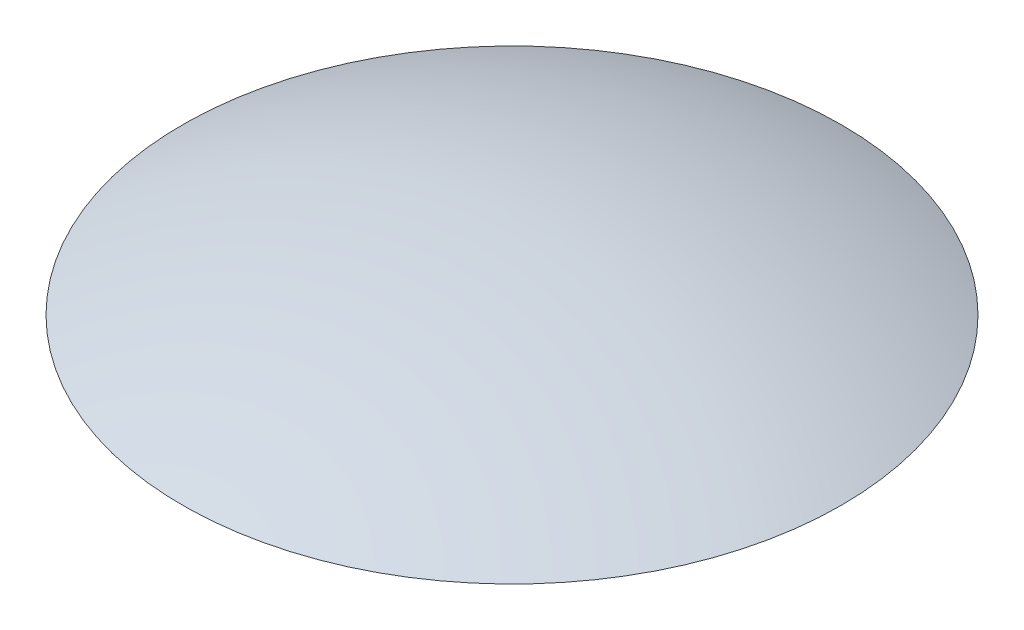
ISO-10303-21;
HEADER;
FILE_DESCRIPTION(('STEP AP214'),'2;1');
FILE_NAME('part.step','',(''),(''),'','','');
FILE_SCHEMA(('AUTOMOTIVE_DESIGN { 1 0 10303 214 1 1 1 1 }'));
ENDSEC;
DATA;
#1=APPLICATION_CONTEXT('core data for automotive mechanical design processes');
#2=APPLICATION_PROTOCOL_DEFINITION('international standard','automotive_design',2000,#1);
#3=PRODUCT_CONTEXT('',#1,'mechanical');
#4=PRODUCT('Part','Part','',(#3));
#5=PRODUCT_RELATED_PRODUCT_CATEGORY('part','',(#4));
#6=PRODUCT_DEFINITION_FORMATION('','',#4);
#7=PRODUCT_DEFINITION_CONTEXT('part definition',#1,'design');
#8=PRODUCT_DEFINITION('design','',#6,#7);
#9=PRODUCT_DEFINITION_SHAPE('','',#8);
#10=(LENGTH_UNIT() NAMED_UNIT(*) SI_UNIT(.MILLI.,.METRE.));
#11=(NAMED_UNIT(*) PLANE_ANGLE_UNIT() SI_UNIT($,.RADIAN.));
#12=(NAMED_UNIT(*) SI_UNIT($,.STERADIAN.) SOLID_ANGLE_UNIT());
#13=UNCERTAINTY_MEASURE_WITH_UNIT(LENGTH_MEASURE(1.E-05),#10,'distance_accuracy_value','');
#14=(GEOMETRIC_REPRESENTATION_CONTEXT(3) GLOBAL_UNCERTAINTY_ASSIGNED_CONTEXT((#13)) GLOBAL_UNIT_ASSIGNED_CONTEXT((#10,
#11,#12)) REPRESENTATION_CONTEXT('',''));
#15=CARTESIAN_POINT('',(0.,0.,0.));
#16=DIRECTION('',(0.,0.,1.));
#17=DIRECTION('',(1.,0.,0.));
#18=AXIS2_PLACEMENT_3D('',#15,#16,#17);
#19=CARTESIAN_POINT('',(0.,0.,0.));
#20=DIRECTION('',(0.,-1.,0.));
#21=DIRECTION('',(1.,0.,0.));
#22=AXIS2_PLACEMENT_3D('',#19,#20,#21);
#23=SPHERICAL_SURFACE('',#22,16.8);
#24=CARTESIAN_POINT('',(0.,15.27219696049,0.));
#25=DIRECTION('',(0.,-1.,0.));
#26=DIRECTION('',(0.,0.,-1.));
#27=AXIS2_PLACEMENT_3D('',#24,#25,#26);
#28=CIRCLE('',#27,7.);
#29=CARTESIAN_POINT('',(0.,15.27219696049,-7.));
#30=VERTEX_POINT('',#29);
#31=EDGE_CURVE('E40',#30,#30,#28,.T.);
#32=ORIENTED_EDGE('',*,*,#31,.F.);
#33=EDGE_LOOP('',(#32));
#34=FACE_BOUND('',#33,.T.);
#35=ADVANCED_FACE('F34',(#34),#23,.T.);
#36=CARTESIAN_POINT('',(0.,0.,0.));
#37=DIRECTION('',(0.,-1.,0.));
#38=DIRECTION('',(1.,0.,0.));
#39=AXIS2_PLACEMENT_3D('',#36,#37,#38);
#40=SPHERICAL_SURFACE('',#39,15.8);
#41=CARTESIAN_POINT('',(0.,15.27219696049,0.));
#42=DIRECTION('',(0.,-1.,0.));
#43=DIRECTION('',(0.,0.,-1.));
#44=AXIS2_PLACEMENT_3D('',#41,#42,#43);
#45=CIRCLE('',#44,4.04969134626331);
#46=CARTESIAN_POINT('',(0.,15.27219696049,-4.04969134626331));
#47=VERTEX_POINT('',#46);
#48=EDGE_CURVE('E10',#47,#47,#45,.T.);
#49=ORIENTED_EDGE('',*,*,#48,.T.);
#50=EDGE_LOOP('',(#49));
#51=FACE_BOUND('',#50,.T.);
#52=ADVANCED_FACE('F50',(#51),#40,.F.);
#53=CARTESIAN_POINT('',(4.04969134626331,15.27219696049,0.));
#54=DIRECTION('',(0.,-1.,0.));
#55=DIRECTION('',(0.,0.,-1.));
#56=AXIS2_PLACEMENT_3D('',#53,#54,#55);
#57=PLANE('',#56);
#58=ORIENTED_EDGE('',*,*,#31,.T.);
#59=EDGE_LOOP('',(#58));
#60=FACE_BOUND('',#59,.T.);
#61=ORIENTED_EDGE('',*,*,#48,.F.);
#62=EDGE_LOOP('',(#61));
#63=FACE_BOUND('',#62,.T.);
#64=ADVANCED_FACE('F46',(#60,#63),#57,.T.);
#65=CLOSED_SHELL('',(#35,#52,#64));
#66=MANIFOLD_SOLID_BREP('B2',#65);
#67=ADVANCED_BREP_SHAPE_REPRESENTATION('',(#18,#66),#14);
#68=SHAPE_DEFINITION_REPRESENTATION(#9,#67);
ENDSEC;
END-ISO-10303-21;
